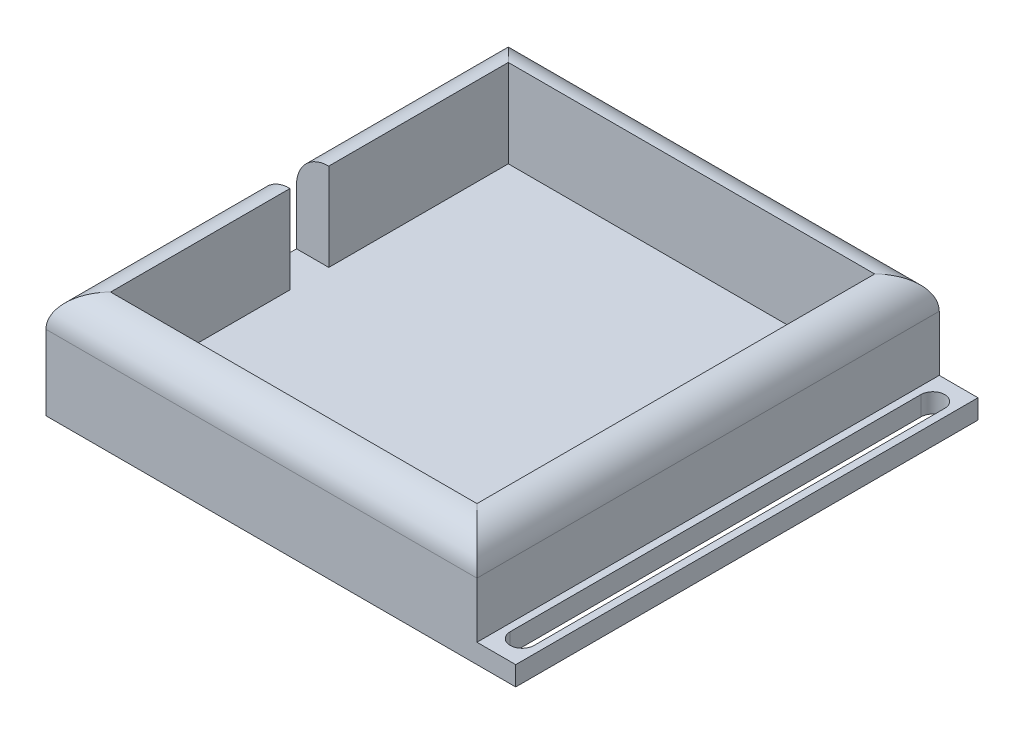
ISO-10303-21;
HEADER;
FILE_DESCRIPTION(('STEP AP214'),'2;1');
FILE_NAME('part.step','',(''),(''),'','','');
FILE_SCHEMA(('AUTOMOTIVE_DESIGN { 1 0 10303 214 1 1 1 1 }'));
ENDSEC;
DATA;
#1=APPLICATION_CONTEXT('core data for automotive mechanical design processes');
#2=APPLICATION_PROTOCOL_DEFINITION('international standard','automotive_design',2000,#1);
#3=PRODUCT_CONTEXT('',#1,'mechanical');
#4=PRODUCT('Part','Part','',(#3));
#5=PRODUCT_RELATED_PRODUCT_CATEGORY('part','',(#4));
#6=PRODUCT_DEFINITION_FORMATION('','',#4);
#7=PRODUCT_DEFINITION_CONTEXT('part definition',#1,'design');
#8=PRODUCT_DEFINITION('design','',#6,#7);
#9=PRODUCT_DEFINITION_SHAPE('','',#8);
#10=(LENGTH_UNIT() NAMED_UNIT(*) SI_UNIT(.MILLI.,.METRE.));
#11=(NAMED_UNIT(*) PLANE_ANGLE_UNIT() SI_UNIT($,.RADIAN.));
#12=(NAMED_UNIT(*) SI_UNIT($,.STERADIAN.) SOLID_ANGLE_UNIT());
#13=UNCERTAINTY_MEASURE_WITH_UNIT(LENGTH_MEASURE(1.E-05),#10,'distance_accuracy_value','');
#14=(GEOMETRIC_REPRESENTATION_CONTEXT(3) GLOBAL_UNCERTAINTY_ASSIGNED_CONTEXT((#13)) GLOBAL_UNIT_ASSIGNED_CONTEXT((#10,
#11,#12)) REPRESENTATION_CONTEXT('',''));
#15=CARTESIAN_POINT('',(0.,0.,0.));
#16=DIRECTION('',(0.,0.,1.));
#17=DIRECTION('',(1.,0.,0.));
#18=AXIS2_PLACEMENT_3D('',#15,#16,#17);
#19=CARTESIAN_POINT('',(61.75,13.6,0.));
#20=DIRECTION('',(-1.,0.,0.));
#21=DIRECTION('',(0.,0.,1.));
#22=AXIS2_PLACEMENT_3D('',#19,#20,#21);
#23=PLANE('',#22);
#24=DIRECTION('',(0.,0.,1.));
#25=VECTOR('',#24,1.);
#26=CARTESIAN_POINT('',(61.75,0.,0.));
#27=LINE('',#26,#25);
#28=CARTESIAN_POINT('',(61.75,0.,-66.6));
#29=VERTEX_POINT('',#28);
#30=CARTESIAN_POINT('',(61.75,0.,5.));
#31=VERTEX_POINT('',#30);
#32=EDGE_CURVE('E218',#29,#31,#27,.T.);
#33=ORIENTED_EDGE('',*,*,#32,.F.);
#34=DIRECTION('',(0.,-1.,0.));
#35=VECTOR('',#34,1.);
#36=CARTESIAN_POINT('',(61.75,13.6,-66.6));
#37=LINE('',#36,#35);
#38=CARTESIAN_POINT('',(61.75,8.6,-66.6));
#39=VERTEX_POINT('',#38);
#40=EDGE_CURVE('E329',#39,#29,#37,.T.);
#41=ORIENTED_EDGE('',*,*,#40,.F.);
#42=DIRECTION('',(0.,0.,-1.));
#43=VECTOR('',#42,1.);
#44=CARTESIAN_POINT('',(61.75,8.6,5.));
#45=LINE('',#44,#43);
#46=CARTESIAN_POINT('',(61.75,8.6,5.));
#47=VERTEX_POINT('',#46);
#48=EDGE_CURVE('E11',#39,#47,#45,.F.);
#49=ORIENTED_EDGE('',*,*,#48,.T.);
#50=DIRECTION('',(0.,-1.,0.));
#51=VECTOR('',#50,1.);
#52=CARTESIAN_POINT('',(61.75,13.6,5.));
#53=LINE('',#52,#51);
#54=EDGE_CURVE('E332',#47,#31,#53,.T.);
#55=ORIENTED_EDGE('',*,*,#54,.T.);
#56=EDGE_LOOP('',(#33,#41,#49,#55));
#57=FACE_BOUND('',#56,.T.);
#58=ADVANCED_FACE('F41',(#57),#23,.F.);
#59=CARTESIAN_POINT('',(56.75,13.6,0.));
#60=DIRECTION('',(-1.,0.,0.));
#61=DIRECTION('',(0.,0.,1.));
#62=AXIS2_PLACEMENT_3D('',#59,#60,#61);
#63=PLANE('',#62);
#64=DIRECTION('',(0.,0.,-1.));
#65=VECTOR('',#64,1.);
#66=CARTESIAN_POINT('',(56.75,0.,0.));
#67=LINE('',#66,#65);
#68=CARTESIAN_POINT('',(56.75,0.,0.));
#69=VERTEX_POINT('',#68);
#70=CARTESIAN_POINT('',(56.75,0.,-61.6));
#71=VERTEX_POINT('',#70);
#72=EDGE_CURVE('E263',#69,#71,#67,.T.);
#73=ORIENTED_EDGE('',*,*,#72,.F.);
#74=DIRECTION('',(0.,-1.,0.));
#75=VECTOR('',#74,1.);
#76=CARTESIAN_POINT('',(56.75,13.6,0.));
#77=LINE('',#76,#75);
#78=CARTESIAN_POINT('',(56.75,13.6,0.));
#79=VERTEX_POINT('',#78);
#80=EDGE_CURVE('E347',#79,#69,#77,.T.);
#81=ORIENTED_EDGE('',*,*,#80,.F.);
#82=DIRECTION('',(0.,0.,-1.));
#83=VECTOR('',#82,1.);
#84=CARTESIAN_POINT('',(56.75,13.6,0.));
#85=LINE('',#84,#83);
#86=CARTESIAN_POINT('',(56.75,13.6,-61.6));
#87=VERTEX_POINT('',#86);
#88=EDGE_CURVE('E267',#79,#87,#85,.T.);
#89=ORIENTED_EDGE('',*,*,#88,.T.);
#90=DIRECTION('',(0.,-1.,0.));
#91=VECTOR('',#90,1.);
#92=CARTESIAN_POINT('',(56.75,13.6,-61.6));
#93=LINE('',#92,#91);
#94=EDGE_CURVE('E288',#87,#71,#93,.T.);
#95=ORIENTED_EDGE('',*,*,#94,.T.);
#96=EDGE_LOOP('',(#73,#81,#89,#95));
#97=FACE_BOUND('',#96,.T.);
#98=ADVANCED_FACE('F419',(#97),#63,.T.);
#99=CARTESIAN_POINT('',(0.,13.6,0.));
#100=DIRECTION('',(0.,0.,-1.));
#101=DIRECTION('',(-1.,0.,0.));
#102=AXIS2_PLACEMENT_3D('',#99,#100,#101);
#103=PLANE('',#102);
#104=DIRECTION('',(1.,0.,0.));
#105=VECTOR('',#104,1.);
#106=CARTESIAN_POINT('',(0.,0.,0.));
#107=LINE('',#106,#105);
#108=CARTESIAN_POINT('',(0.,0.,0.));
#109=VERTEX_POINT('',#108);
#110=EDGE_CURVE('E292',#109,#69,#107,.T.);
#111=ORIENTED_EDGE('',*,*,#110,.F.);
#112=DIRECTION('',(0.,-1.,0.));
#113=VECTOR('',#112,1.);
#114=CARTESIAN_POINT('',(0.,13.6,0.));
#115=LINE('',#114,#113);
#116=CARTESIAN_POINT('',(0.,13.6,0.));
#117=VERTEX_POINT('',#116);
#118=EDGE_CURVE('E344',#117,#109,#115,.T.);
#119=ORIENTED_EDGE('',*,*,#118,.F.);
#120=DIRECTION('',(1.,0.,0.));
#121=VECTOR('',#120,1.);
#122=CARTESIAN_POINT('',(0.,13.6,0.));
#123=LINE('',#122,#121);
#124=EDGE_CURVE('E271',#117,#79,#123,.T.);
#125=ORIENTED_EDGE('',*,*,#124,.T.);
#126=ORIENTED_EDGE('',*,*,#80,.T.);
#127=EDGE_LOOP('',(#111,#119,#125,#126));
#128=FACE_BOUND('',#127,.T.);
#129=ADVANCED_FACE('F422',(#128),#103,.T.);
#130=CARTESIAN_POINT('',(0.,13.6,0.));
#131=DIRECTION('',(-1.,0.,0.));
#132=DIRECTION('',(0.,0.,1.));
#133=AXIS2_PLACEMENT_3D('',#130,#131,#132);
#134=PLANE('',#133);
#135=DIRECTION('',(0.,0.,-1.));
#136=VECTOR('',#135,1.);
#137=CARTESIAN_POINT('',(0.,0.,0.));
#138=LINE('',#137,#136);
#139=CARTESIAN_POINT('',(0.,0.,-27.8));
#140=VERTEX_POINT('',#139);
#141=EDGE_CURVE('E296',#109,#140,#138,.T.);
#142=ORIENTED_EDGE('',*,*,#141,.T.);
#143=DIRECTION('',(0.,-1.,0.));
#144=VECTOR('',#143,1.);
#145=CARTESIAN_POINT('',(0.,13.6,-27.8));
#146=LINE('',#145,#144);
#147=CARTESIAN_POINT('',(0.,13.6,-27.8));
#148=VERTEX_POINT('',#147);
#149=EDGE_CURVE('E341',#148,#140,#146,.T.);
#150=ORIENTED_EDGE('',*,*,#149,.F.);
#151=DIRECTION('',(0.,0.,-1.));
#152=VECTOR('',#151,1.);
#153=CARTESIAN_POINT('',(0.,13.6,0.));
#154=LINE('',#153,#152);
#155=EDGE_CURVE('E276',#117,#148,#154,.T.);
#156=ORIENTED_EDGE('',*,*,#155,.F.);
#157=ORIENTED_EDGE('',*,*,#118,.T.);
#158=EDGE_LOOP('',(#142,#150,#156,#157));
#159=FACE_BOUND('',#158,.T.);
#160=ADVANCED_FACE('F424',(#159),#134,.F.);
#161=CARTESIAN_POINT('',(0.,13.6,-27.8));
#162=DIRECTION('',(0.,0.,-1.));
#163=DIRECTION('',(-1.,0.,0.));
#164=AXIS2_PLACEMENT_3D('',#161,#162,#163);
#165=PLANE('',#164);
#166=DIRECTION('',(0.,-1.,0.));
#167=VECTOR('',#166,1.);
#168=CARTESIAN_POINT('',(-5.,13.6,-27.8));
#169=LINE('',#168,#167);
#170=CARTESIAN_POINT('',(-5.,8.6,-27.8));
#171=VERTEX_POINT('',#170);
#172=CARTESIAN_POINT('',(-5.,0.,-27.8));
#173=VERTEX_POINT('',#172);
#174=EDGE_CURVE('E338',#171,#173,#169,.T.);
#175=ORIENTED_EDGE('',*,*,#174,.F.);
#176=CARTESIAN_POINT('',(0.,8.6,-27.8));
#177=DIRECTION('',(0.,0.,-1.));
#178=DIRECTION('',(-1.,0.,0.));
#179=AXIS2_PLACEMENT_3D('',#176,#177,#178);
#180=CIRCLE('',#179,5.);
#181=EDGE_CURVE('E361',#171,#148,#180,.T.);
#182=ORIENTED_EDGE('',*,*,#181,.T.);
#183=ORIENTED_EDGE('',*,*,#149,.T.);
#184=DIRECTION('',(1.,0.,0.));
#185=VECTOR('',#184,1.);
#186=CARTESIAN_POINT('',(0.,0.,-27.8));
#187=LINE('',#186,#185);
#188=EDGE_CURVE('E300',#173,#140,#187,.T.);
#189=ORIENTED_EDGE('',*,*,#188,.F.);
#190=EDGE_LOOP('',(#175,#182,#183,#189));
#191=FACE_BOUND('',#190,.T.);
#192=ADVANCED_FACE('F398',(#191),#165,.T.);
#193=CARTESIAN_POINT('',(0.,13.6,5.));
#194=DIRECTION('',(0.,0.,-1.));
#195=DIRECTION('',(-1.,0.,0.));
#196=AXIS2_PLACEMENT_3D('',#193,#194,#195);
#197=PLANE('',#196);
#198=ORIENTED_EDGE('',*,*,#54,.F.);
#199=DIRECTION('',(1.,0.,0.));
#200=VECTOR('',#199,1.);
#201=CARTESIAN_POINT('',(-5.,8.6,5.));
#202=LINE('',#201,#200);
#203=CARTESIAN_POINT('',(-5.,8.6,5.));
#204=VERTEX_POINT('',#203);
#205=EDGE_CURVE('E51',#47,#204,#202,.F.);
#206=ORIENTED_EDGE('',*,*,#205,.T.);
#207=DIRECTION('',(0.,-1.,0.));
#208=VECTOR('',#207,1.);
#209=CARTESIAN_POINT('',(-5.,13.6,5.));
#210=LINE('',#209,#208);
#211=CARTESIAN_POINT('',(-5.,-3.,5.));
#212=VERTEX_POINT('',#211);
#213=EDGE_CURVE('E335',#204,#212,#210,.T.);
#214=ORIENTED_EDGE('',*,*,#213,.T.);
#215=DIRECTION('',(-1.,0.,0.));
#216=VECTOR('',#215,1.);
#217=CARTESIAN_POINT('',(0.,-3.,5.));
#218=LINE('',#217,#216);
#219=CARTESIAN_POINT('',(67.75,-3.,5.));
#220=VERTEX_POINT('',#219);
#221=EDGE_CURVE('E251',#220,#212,#218,.T.);
#222=ORIENTED_EDGE('',*,*,#221,.F.);
#223=DIRECTION('',(0.,-1.,0.));
#224=VECTOR('',#223,1.);
#225=CARTESIAN_POINT('',(67.75,0.,5.));
#226=LINE('',#225,#224);
#227=CARTESIAN_POINT('',(67.75,0.,5.));
#228=VERTEX_POINT('',#227);
#229=EDGE_CURVE('E240',#228,#220,#226,.T.);
#230=ORIENTED_EDGE('',*,*,#229,.F.);
#231=DIRECTION('',(1.,0.,0.));
#232=VECTOR('',#231,1.);
#233=CARTESIAN_POINT('',(0.,0.,4.99999999999999));
#234=LINE('',#233,#232);
#235=EDGE_CURVE('E215',#31,#228,#234,.T.);
#236=ORIENTED_EDGE('',*,*,#235,.F.);
#237=EDGE_LOOP('',(#198,#206,#214,#222,#230,#236));
#238=FACE_BOUND('',#237,.T.);
#239=ADVANCED_FACE('F449',(#238),#197,.F.);
#240=CARTESIAN_POINT('',(0.,13.6,-66.6));
#241=DIRECTION('',(0.,0.,-1.));
#242=DIRECTION('',(-1.,0.,0.));
#243=AXIS2_PLACEMENT_3D('',#240,#241,#242);
#244=PLANE('',#243);
#245=DIRECTION('',(0.,-1.,0.));
#246=VECTOR('',#245,1.);
#247=CARTESIAN_POINT('',(-5.,13.6,-66.6));
#248=LINE('',#247,#246);
#249=CARTESIAN_POINT('',(-5.,8.6,-66.6));
#250=VERTEX_POINT('',#249);
#251=CARTESIAN_POINT('',(-5.,-3.,-66.6));
#252=VERTEX_POINT('',#251);
#253=EDGE_CURVE('E326',#250,#252,#248,.T.);
#254=ORIENTED_EDGE('',*,*,#253,.F.);
#255=DIRECTION('',(1.,0.,0.));
#256=VECTOR('',#255,1.);
#257=CARTESIAN_POINT('',(0.,8.6,-66.6));
#258=LINE('',#257,#256);
#259=EDGE_CURVE('E65',#250,#39,#258,.T.);
#260=ORIENTED_EDGE('',*,*,#259,.T.);
#261=ORIENTED_EDGE('',*,*,#40,.T.);
#262=DIRECTION('',(1.,0.,0.));
#263=VECTOR('',#262,1.);
#264=CARTESIAN_POINT('',(0.,0.,-66.6));
#265=LINE('',#264,#263);
#266=CARTESIAN_POINT('',(67.75,0.,-66.6));
#267=VERTEX_POINT('',#266);
#268=EDGE_CURVE('E194',#29,#267,#265,.T.);
#269=ORIENTED_EDGE('',*,*,#268,.T.);
#270=DIRECTION('',(0.,-1.,0.));
#271=VECTOR('',#270,1.);
#272=CARTESIAN_POINT('',(67.75,0.,-66.6));
#273=LINE('',#272,#271);
#274=CARTESIAN_POINT('',(67.75,-3.,-66.6));
#275=VERTEX_POINT('',#274);
#276=EDGE_CURVE('E235',#267,#275,#273,.T.);
#277=ORIENTED_EDGE('',*,*,#276,.T.);
#278=DIRECTION('',(1.,0.,0.));
#279=VECTOR('',#278,1.);
#280=CARTESIAN_POINT('',(0.,-3.,-66.6));
#281=LINE('',#280,#279);
#282=EDGE_CURVE('E260',#252,#275,#281,.T.);
#283=ORIENTED_EDGE('',*,*,#282,.F.);
#284=EDGE_LOOP('',(#254,#260,#261,#269,#277,#283));
#285=FACE_BOUND('',#284,.T.);
#286=ADVANCED_FACE('F438',(#285),#244,.T.);
#287=CARTESIAN_POINT('',(-5.,13.6,0.));
#288=DIRECTION('',(-1.,0.,0.));
#289=DIRECTION('',(0.,0.,1.));
#290=AXIS2_PLACEMENT_3D('',#287,#288,#289);
#291=PLANE('',#290);
#292=DIRECTION('',(0.,-1.,0.));
#293=VECTOR('',#292,1.);
#294=CARTESIAN_POINT('',(-5.,13.6,-33.8));
#295=LINE('',#294,#293);
#296=CARTESIAN_POINT('',(-5.,8.6,-33.8));
#297=VERTEX_POINT('',#296);
#298=CARTESIAN_POINT('',(-5.,0.,-33.8));
#299=VERTEX_POINT('',#298);
#300=EDGE_CURVE('E323',#297,#299,#295,.T.);
#301=ORIENTED_EDGE('',*,*,#300,.F.);
#302=DIRECTION('',(0.,0.,-1.));
#303=VECTOR('',#302,1.);
#304=CARTESIAN_POINT('',(-5.,8.6,0.));
#305=LINE('',#304,#303);
#306=EDGE_CURVE('E354',#297,#250,#305,.T.);
#307=ORIENTED_EDGE('',*,*,#306,.T.);
#308=ORIENTED_EDGE('',*,*,#253,.T.);
#309=DIRECTION('',(0.,0.,-1.));
#310=VECTOR('',#309,1.);
#311=CARTESIAN_POINT('',(-5.,-3.,0.));
#312=LINE('',#311,#310);
#313=EDGE_CURVE('E255',#212,#252,#312,.T.);
#314=ORIENTED_EDGE('',*,*,#313,.F.);
#315=ORIENTED_EDGE('',*,*,#213,.F.);
#316=DIRECTION('',(0.,0.,-1.));
#317=VECTOR('',#316,1.);
#318=CARTESIAN_POINT('',(-5.,8.6,0.));
#319=LINE('',#318,#317);
#320=EDGE_CURVE('E351',#204,#171,#319,.T.);
#321=ORIENTED_EDGE('',*,*,#320,.T.);
#322=ORIENTED_EDGE('',*,*,#174,.T.);
#323=DIRECTION('',(0.,0.,-1.));
#324=VECTOR('',#323,1.);
#325=CARTESIAN_POINT('',(-5.,0.,0.));
#326=LINE('',#325,#324);
#327=EDGE_CURVE('E256',#173,#299,#326,.T.);
#328=ORIENTED_EDGE('',*,*,#327,.T.);
#329=EDGE_LOOP('',(#301,#307,#308,#314,#315,#321,#322,#328));
#330=FACE_BOUND('',#329,.T.);
#331=ADVANCED_FACE('F394',(#330),#291,.T.);
#332=CARTESIAN_POINT('',(0.,13.6,-33.8));
#333=DIRECTION('',(0.,0.,-1.));
#334=DIRECTION('',(-1.,0.,0.));
#335=AXIS2_PLACEMENT_3D('',#332,#333,#334);
#336=PLANE('',#335);
#337=DIRECTION('',(0.,-1.,0.));
#338=VECTOR('',#337,1.);
#339=CARTESIAN_POINT('',(0.,13.6,-33.8));
#340=LINE('',#339,#338);
#341=CARTESIAN_POINT('',(0.,13.6,-33.8));
#342=VERTEX_POINT('',#341);
#343=CARTESIAN_POINT('',(0.,0.,-33.8));
#344=VERTEX_POINT('',#343);
#345=EDGE_CURVE('E319',#342,#344,#340,.T.);
#346=ORIENTED_EDGE('',*,*,#345,.F.);
#347=CARTESIAN_POINT('',(0.,8.6,-33.8));
#348=DIRECTION('',(0.,0.,-1.));
#349=DIRECTION('',(-1.,0.,0.));
#350=AXIS2_PLACEMENT_3D('',#347,#348,#349);
#351=CIRCLE('',#350,5.);
#352=EDGE_CURVE('E358',#342,#297,#351,.F.);
#353=ORIENTED_EDGE('',*,*,#352,.T.);
#354=ORIENTED_EDGE('',*,*,#300,.T.);
#355=DIRECTION('',(1.,0.,0.));
#356=VECTOR('',#355,1.);
#357=CARTESIAN_POINT('',(0.,0.,-33.8));
#358=LINE('',#357,#356);
#359=EDGE_CURVE('E304',#299,#344,#358,.T.);
#360=ORIENTED_EDGE('',*,*,#359,.T.);
#361=EDGE_LOOP('',(#346,#353,#354,#360));
#362=FACE_BOUND('',#361,.T.);
#363=ADVANCED_FACE('F430',(#362),#336,.F.);
#364=CARTESIAN_POINT('',(0.,13.6,0.));
#365=DIRECTION('',(-1.,0.,0.));
#366=DIRECTION('',(0.,0.,1.));
#367=AXIS2_PLACEMENT_3D('',#364,#365,#366);
#368=PLANE('',#367);
#369=DIRECTION('',(0.,0.,-1.));
#370=VECTOR('',#369,1.);
#371=CARTESIAN_POINT('',(0.,0.,0.));
#372=LINE('',#371,#370);
#373=CARTESIAN_POINT('',(0.,0.,-61.6));
#374=VERTEX_POINT('',#373);
#375=EDGE_CURVE('E307',#344,#374,#372,.T.);
#376=ORIENTED_EDGE('',*,*,#375,.T.);
#377=DIRECTION('',(0.,-1.,0.));
#378=VECTOR('',#377,1.);
#379=CARTESIAN_POINT('',(0.,13.6,-61.6));
#380=LINE('',#379,#378);
#381=CARTESIAN_POINT('',(0.,13.6,-61.6));
#382=VERTEX_POINT('',#381);
#383=EDGE_CURVE('E315',#382,#374,#380,.T.);
#384=ORIENTED_EDGE('',*,*,#383,.F.);
#385=DIRECTION('',(0.,0.,-1.));
#386=VECTOR('',#385,1.);
#387=CARTESIAN_POINT('',(0.,13.6,0.));
#388=LINE('',#387,#386);
#389=EDGE_CURVE('E280',#342,#382,#388,.T.);
#390=ORIENTED_EDGE('',*,*,#389,.F.);
#391=ORIENTED_EDGE('',*,*,#345,.T.);
#392=EDGE_LOOP('',(#376,#384,#390,#391));
#393=FACE_BOUND('',#392,.T.);
#394=ADVANCED_FACE('F429',(#393),#368,.F.);
#395=CARTESIAN_POINT('',(0.,13.6,-61.6));
#396=DIRECTION('',(0.,0.,-1.));
#397=DIRECTION('',(-1.,0.,0.));
#398=AXIS2_PLACEMENT_3D('',#395,#396,#397);
#399=PLANE('',#398);
#400=DIRECTION('',(1.,0.,0.));
#401=VECTOR('',#400,1.);
#402=CARTESIAN_POINT('',(0.,0.,-61.6));
#403=LINE('',#402,#401);
#404=EDGE_CURVE('E272',#374,#71,#403,.T.);
#405=ORIENTED_EDGE('',*,*,#404,.T.);
#406=ORIENTED_EDGE('',*,*,#94,.F.);
#407=DIRECTION('',(1.,0.,0.));
#408=VECTOR('',#407,1.);
#409=CARTESIAN_POINT('',(0.,13.6,-61.6));
#410=LINE('',#409,#408);
#411=EDGE_CURVE('E284',#382,#87,#410,.T.);
#412=ORIENTED_EDGE('',*,*,#411,.F.);
#413=ORIENTED_EDGE('',*,*,#383,.T.);
#414=EDGE_LOOP('',(#405,#406,#412,#413));
#415=FACE_BOUND('',#414,.T.);
#416=ADVANCED_FACE('F427',(#415),#399,.F.);
#417=CARTESIAN_POINT('',(0.,-3.,0.));
#418=DIRECTION('',(0.,-1.,0.));
#419=DIRECTION('',(0.,0.,-1.));
#420=AXIS2_PLACEMENT_3D('',#417,#418,#419);
#421=PLANE('',#420);
#422=ORIENTED_EDGE('',*,*,#221,.T.);
#423=ORIENTED_EDGE('',*,*,#313,.T.);
#424=ORIENTED_EDGE('',*,*,#282,.T.);
#425=DIRECTION('',(0.,0.,-1.));
#426=VECTOR('',#425,1.);
#427=CARTESIAN_POINT('',(67.75,-3.,0.));
#428=LINE('',#427,#426);
#429=EDGE_CURVE('E200',#220,#275,#428,.T.);
#430=ORIENTED_EDGE('',*,*,#429,.F.);
#431=EDGE_LOOP('',(#422,#423,#424,#430));
#432=FACE_BOUND('',#431,.T.);
#433=CARTESIAN_POINT('',(64.75,-3.,-62.6));
#434=DIRECTION('',(0.,-1.,0.));
#435=DIRECTION('',(0.,0.,-1.));
#436=AXIS2_PLACEMENT_3D('',#433,#434,#435);
#437=CIRCLE('',#436,1.85000000000001);
#438=CARTESIAN_POINT('',(62.9,-3.,-62.6));
#439=VERTEX_POINT('',#438);
#440=CARTESIAN_POINT('',(66.6,-3.,-62.6));
#441=VERTEX_POINT('',#440);
#442=EDGE_CURVE('E224',#439,#441,#437,.T.);
#443=ORIENTED_EDGE('',*,*,#442,.F.);
#444=DIRECTION('',(0.,0.,-1.));
#445=VECTOR('',#444,1.);
#446=CARTESIAN_POINT('',(62.9,-3.,0.));
#447=LINE('',#446,#445);
#448=CARTESIAN_POINT('',(62.9,-3.,1.00000000000001));
#449=VERTEX_POINT('',#448);
#450=EDGE_CURVE('E188',#449,#439,#447,.T.);
#451=ORIENTED_EDGE('',*,*,#450,.F.);
#452=CARTESIAN_POINT('',(64.75,-3.,1.00000000000001));
#453=DIRECTION('',(0.,-1.,0.));
#454=DIRECTION('',(0.,0.,-1.));
#455=AXIS2_PLACEMENT_3D('',#452,#453,#454);
#456=CIRCLE('',#455,1.85);
#457=CARTESIAN_POINT('',(66.6,-3.,1.00000000000001));
#458=VERTEX_POINT('',#457);
#459=EDGE_CURVE('E229',#458,#449,#456,.T.);
#460=ORIENTED_EDGE('',*,*,#459,.F.);
#461=DIRECTION('',(0.,0.,-1.));
#462=VECTOR('',#461,1.);
#463=CARTESIAN_POINT('',(66.6,-3.,0.));
#464=LINE('',#463,#462);
#465=EDGE_CURVE('E204',#458,#441,#464,.T.);
#466=ORIENTED_EDGE('',*,*,#465,.T.);
#467=EDGE_LOOP('',(#443,#451,#460,#466));
#468=FACE_BOUND('',#467,.T.);
#469=ADVANCED_FACE('F472',(#432,#468),#421,.T.);
#470=CARTESIAN_POINT('',(0.,0.,0.));
#471=DIRECTION('',(0.,-1.,0.));
#472=DIRECTION('',(0.,0.,-1.));
#473=AXIS2_PLACEMENT_3D('',#470,#471,#472);
#474=PLANE('',#473);
#475=ORIENTED_EDGE('',*,*,#359,.F.);
#476=ORIENTED_EDGE('',*,*,#327,.F.);
#477=ORIENTED_EDGE('',*,*,#188,.T.);
#478=ORIENTED_EDGE('',*,*,#141,.F.);
#479=ORIENTED_EDGE('',*,*,#110,.T.);
#480=ORIENTED_EDGE('',*,*,#72,.T.);
#481=ORIENTED_EDGE('',*,*,#404,.F.);
#482=ORIENTED_EDGE('',*,*,#375,.F.);
#483=EDGE_LOOP('',(#475,#476,#477,#478,#479,#480,#481,#482));
#484=FACE_BOUND('',#483,.T.);
#485=ADVANCED_FACE('F404',(#484),#474,.F.);
#486=CARTESIAN_POINT('',(0.,8.6,0.));
#487=DIRECTION('',(0.,0.,-1.));
#488=DIRECTION('',(-1.,0.,0.));
#489=AXIS2_PLACEMENT_3D('',#486,#487,#488);
#490=CYLINDRICAL_SURFACE('',#489,5.);
#491=ORIENTED_EDGE('',*,*,#181,.F.);
#492=ORIENTED_EDGE('',*,*,#320,.F.);
#493=CARTESIAN_POINT('',(0.,8.6,0.));
#494=DIRECTION('',(-0.707106781186547,0.,-0.707106781186547));
#495=DIRECTION('',(-0.707106781186547,0.,0.707106781186547));
#496=AXIS2_PLACEMENT_3D('',#493,#494,#495);
#497=ELLIPSE('',#496,7.07106781186547,5.);
#498=EDGE_CURVE('E45',#117,#204,#497,.F.);
#499=ORIENTED_EDGE('',*,*,#498,.F.);
#500=ORIENTED_EDGE('',*,*,#155,.T.);
#501=EDGE_LOOP('',(#491,#492,#499,#500));
#502=FACE_BOUND('',#501,.T.);
#503=ADVANCED_FACE('F43',(#502),#490,.T.);
#504=CARTESIAN_POINT('',(0.,8.6,0.));
#505=DIRECTION('',(-1.,0.,0.));
#506=DIRECTION('',(0.,0.,1.));
#507=AXIS2_PLACEMENT_3D('',#504,#505,#506);
#508=CYLINDRICAL_SURFACE('',#507,5.);
#509=ORIENTED_EDGE('',*,*,#498,.T.);
#510=ORIENTED_EDGE('',*,*,#205,.F.);
#511=CARTESIAN_POINT('',(56.75,8.6,0.));
#512=DIRECTION('',(-0.707106781186547,0.,0.707106781186547));
#513=DIRECTION('',(0.707106781186547,0.,0.707106781186547));
#514=AXIS2_PLACEMENT_3D('',#511,#512,#513);
#515=ELLIPSE('',#514,7.07106781186547,5.);
#516=EDGE_CURVE('E373',#79,#47,#515,.F.);
#517=ORIENTED_EDGE('',*,*,#516,.F.);
#518=ORIENTED_EDGE('',*,*,#124,.F.);
#519=EDGE_LOOP('',(#509,#510,#517,#518));
#520=FACE_BOUND('',#519,.T.);
#521=ADVANCED_FACE('F385',(#520),#508,.T.);
#522=CARTESIAN_POINT('',(56.75,8.6,0.));
#523=DIRECTION('',(0.,0.,1.));
#524=DIRECTION('',(1.,0.,0.));
#525=AXIS2_PLACEMENT_3D('',#522,#523,#524);
#526=CYLINDRICAL_SURFACE('',#525,5.);
#527=ORIENTED_EDGE('',*,*,#516,.T.);
#528=ORIENTED_EDGE('',*,*,#48,.F.);
#529=CARTESIAN_POINT('',(56.75,8.6,-61.6));
#530=DIRECTION('',(0.707106781186547,0.,0.707106781186547));
#531=DIRECTION('',(-0.707106781186547,0.,0.707106781186547));
#532=AXIS2_PLACEMENT_3D('',#529,#530,#531);
#533=ELLIPSE('',#532,7.07106781186547,5.);
#534=EDGE_CURVE('E370',#87,#39,#533,.F.);
#535=ORIENTED_EDGE('',*,*,#534,.F.);
#536=ORIENTED_EDGE('',*,*,#88,.F.);
#537=EDGE_LOOP('',(#527,#528,#535,#536));
#538=FACE_BOUND('',#537,.T.);
#539=ADVANCED_FACE('F417',(#538),#526,.T.);
#540=CARTESIAN_POINT('',(0.,8.6,-61.6));
#541=DIRECTION('',(1.,0.,0.));
#542=DIRECTION('',(0.,0.,-1.));
#543=AXIS2_PLACEMENT_3D('',#540,#541,#542);
#544=CYLINDRICAL_SURFACE('',#543,5.);
#545=ORIENTED_EDGE('',*,*,#534,.T.);
#546=ORIENTED_EDGE('',*,*,#259,.F.);
#547=CARTESIAN_POINT('',(0.,8.6,-61.6));
#548=DIRECTION('',(0.707106781186547,0.,-0.707106781186547));
#549=DIRECTION('',(0.707106781186547,0.,0.707106781186547));
#550=AXIS2_PLACEMENT_3D('',#547,#548,#549);
#551=ELLIPSE('',#550,7.07106781186547,5.);
#552=EDGE_CURVE('E239',#382,#250,#551,.F.);
#553=ORIENTED_EDGE('',*,*,#552,.F.);
#554=ORIENTED_EDGE('',*,*,#411,.T.);
#555=EDGE_LOOP('',(#545,#546,#553,#554));
#556=FACE_BOUND('',#555,.T.);
#557=ADVANCED_FACE('F414',(#556),#544,.T.);
#558=CARTESIAN_POINT('',(0.,8.6,0.));
#559=DIRECTION('',(0.,0.,-1.));
#560=DIRECTION('',(-1.,0.,0.));
#561=AXIS2_PLACEMENT_3D('',#558,#559,#560);
#562=CYLINDRICAL_SURFACE('',#561,5.);
#563=ORIENTED_EDGE('',*,*,#352,.F.);
#564=ORIENTED_EDGE('',*,*,#389,.T.);
#565=ORIENTED_EDGE('',*,*,#552,.T.);
#566=ORIENTED_EDGE('',*,*,#306,.F.);
#567=EDGE_LOOP('',(#563,#564,#565,#566));
#568=FACE_BOUND('',#567,.T.);
#569=ADVANCED_FACE('F410',(#568),#562,.T.);
#570=CARTESIAN_POINT('',(67.75,0.,0.));
#571=DIRECTION('',(-1.,0.,0.));
#572=DIRECTION('',(0.,0.,1.));
#573=AXIS2_PLACEMENT_3D('',#570,#571,#572);
#574=PLANE('',#573);
#575=ORIENTED_EDGE('',*,*,#429,.T.);
#576=ORIENTED_EDGE('',*,*,#276,.F.);
#577=DIRECTION('',(0.,0.,-1.));
#578=VECTOR('',#577,1.);
#579=CARTESIAN_POINT('',(67.75,0.,0.));
#580=LINE('',#579,#578);
#581=EDGE_CURVE('E212',#228,#267,#580,.T.);
#582=ORIENTED_EDGE('',*,*,#581,.F.);
#583=ORIENTED_EDGE('',*,*,#229,.T.);
#584=EDGE_LOOP('',(#575,#576,#582,#583));
#585=FACE_BOUND('',#584,.T.);
#586=ADVANCED_FACE('F461',(#585),#574,.F.);
#587=CARTESIAN_POINT('',(64.75,0.,-62.6));
#588=DIRECTION('',(0.,-1.,0.));
#589=DIRECTION('',(0.,0.,-1.));
#590=AXIS2_PLACEMENT_3D('',#587,#588,#589);
#591=CYLINDRICAL_SURFACE('',#590,1.85000000000001);
#592=ORIENTED_EDGE('',*,*,#442,.T.);
#593=DIRECTION('',(0.,-1.,0.));
#594=VECTOR('',#593,1.);
#595=CARTESIAN_POINT('',(66.6,0.,-62.6));
#596=LINE('',#595,#594);
#597=CARTESIAN_POINT('',(66.6,0.,-62.6));
#598=VERTEX_POINT('',#597);
#599=EDGE_CURVE('E197',#598,#441,#596,.T.);
#600=ORIENTED_EDGE('',*,*,#599,.F.);
#601=CARTESIAN_POINT('',(64.75,0.,-62.6));
#602=DIRECTION('',(0.,-1.,0.));
#603=DIRECTION('',(0.,0.,-1.));
#604=AXIS2_PLACEMENT_3D('',#601,#602,#603);
#605=CIRCLE('',#604,1.85000000000001);
#606=CARTESIAN_POINT('',(62.9,0.,-62.6));
#607=VERTEX_POINT('',#606);
#608=EDGE_CURVE('E175',#607,#598,#605,.T.);
#609=ORIENTED_EDGE('',*,*,#608,.F.);
#610=DIRECTION('',(0.,-1.,0.));
#611=VECTOR('',#610,1.);
#612=CARTESIAN_POINT('',(62.9,0.,-62.6));
#613=LINE('',#612,#611);
#614=EDGE_CURVE('E185',#607,#439,#613,.T.);
#615=ORIENTED_EDGE('',*,*,#614,.T.);
#616=EDGE_LOOP('',(#592,#600,#609,#615));
#617=FACE_BOUND('',#616,.T.);
#618=ADVANCED_FACE('F196',(#617),#591,.F.);
#619=CARTESIAN_POINT('',(66.6,0.,0.));
#620=DIRECTION('',(-1.,0.,0.));
#621=DIRECTION('',(0.,0.,1.));
#622=AXIS2_PLACEMENT_3D('',#619,#620,#621);
#623=PLANE('',#622);
#624=ORIENTED_EDGE('',*,*,#465,.F.);
#625=DIRECTION('',(0.,-1.,0.));
#626=VECTOR('',#625,1.);
#627=CARTESIAN_POINT('',(66.6,0.,1.00000000000001));
#628=LINE('',#627,#626);
#629=CARTESIAN_POINT('',(66.6,0.,1.00000000000001));
#630=VERTEX_POINT('',#629);
#631=EDGE_CURVE('E246',#630,#458,#628,.T.);
#632=ORIENTED_EDGE('',*,*,#631,.F.);
#633=DIRECTION('',(0.,0.,-1.));
#634=VECTOR('',#633,1.);
#635=CARTESIAN_POINT('',(66.6,0.,0.));
#636=LINE('',#635,#634);
#637=EDGE_CURVE('E209',#630,#598,#636,.T.);
#638=ORIENTED_EDGE('',*,*,#637,.T.);
#639=ORIENTED_EDGE('',*,*,#599,.T.);
#640=EDGE_LOOP('',(#624,#632,#638,#639));
#641=FACE_BOUND('',#640,.T.);
#642=ADVANCED_FACE('F514',(#641),#623,.T.);
#643=CARTESIAN_POINT('',(64.75,0.,1.00000000000001));
#644=DIRECTION('',(0.,-1.,0.));
#645=DIRECTION('',(0.,0.,-1.));
#646=AXIS2_PLACEMENT_3D('',#643,#644,#645);
#647=CYLINDRICAL_SURFACE('',#646,1.85);
#648=ORIENTED_EDGE('',*,*,#459,.T.);
#649=DIRECTION('',(0.,-1.,0.));
#650=VECTOR('',#649,1.);
#651=CARTESIAN_POINT('',(62.9,0.,1.00000000000001));
#652=LINE('',#651,#650);
#653=CARTESIAN_POINT('',(62.9,0.,1.00000000000001));
#654=VERTEX_POINT('',#653);
#655=EDGE_CURVE('E193',#654,#449,#652,.T.);
#656=ORIENTED_EDGE('',*,*,#655,.F.);
#657=CARTESIAN_POINT('',(64.75,0.,1.00000000000001));
#658=DIRECTION('',(0.,-1.,0.));
#659=DIRECTION('',(0.,0.,-1.));
#660=AXIS2_PLACEMENT_3D('',#657,#658,#659);
#661=CIRCLE('',#660,1.85);
#662=EDGE_CURVE('E178',#630,#654,#661,.T.);
#663=ORIENTED_EDGE('',*,*,#662,.F.);
#664=ORIENTED_EDGE('',*,*,#631,.T.);
#665=EDGE_LOOP('',(#648,#656,#663,#664));
#666=FACE_BOUND('',#665,.T.);
#667=ADVANCED_FACE('F522',(#666),#647,.F.);
#668=CARTESIAN_POINT('',(62.9,0.,0.));
#669=DIRECTION('',(-1.,0.,0.));
#670=DIRECTION('',(0.,0.,1.));
#671=AXIS2_PLACEMENT_3D('',#668,#669,#670);
#672=PLANE('',#671);
#673=ORIENTED_EDGE('',*,*,#450,.T.);
#674=ORIENTED_EDGE('',*,*,#614,.F.);
#675=DIRECTION('',(0.,0.,-1.));
#676=VECTOR('',#675,1.);
#677=CARTESIAN_POINT('',(62.9,0.,0.));
#678=LINE('',#677,#676);
#679=EDGE_CURVE('E169',#654,#607,#678,.T.);
#680=ORIENTED_EDGE('',*,*,#679,.F.);
#681=ORIENTED_EDGE('',*,*,#655,.T.);
#682=EDGE_LOOP('',(#673,#674,#680,#681));
#683=FACE_BOUND('',#682,.T.);
#684=ADVANCED_FACE('F186',(#683),#672,.F.);
#685=CARTESIAN_POINT('',(0.,0.,0.));
#686=DIRECTION('',(0.,-1.,0.));
#687=DIRECTION('',(0.,0.,-1.));
#688=AXIS2_PLACEMENT_3D('',#685,#686,#687);
#689=PLANE('',#688);
#690=ORIENTED_EDGE('',*,*,#608,.T.);
#691=ORIENTED_EDGE('',*,*,#637,.F.);
#692=ORIENTED_EDGE('',*,*,#662,.T.);
#693=ORIENTED_EDGE('',*,*,#679,.T.);
#694=EDGE_LOOP('',(#690,#691,#692,#693));
#695=FACE_BOUND('',#694,.T.);
#696=ORIENTED_EDGE('',*,*,#581,.T.);
#697=ORIENTED_EDGE('',*,*,#268,.F.);
#698=ORIENTED_EDGE('',*,*,#32,.T.);
#699=ORIENTED_EDGE('',*,*,#235,.T.);
#700=EDGE_LOOP('',(#696,#697,#698,#699));
#701=FACE_BOUND('',#700,.T.);
#702=ADVANCED_FACE('F171',(#695,#701),#689,.F.);
#703=CLOSED_SHELL('',(#58,#98,#129,#160,#192,#239,#286,#331,#363,#394,#416,#469,#485,#503,#521,
#539,#557,#569,#586,#618,#642,#667,#684,#702));
#704=MANIFOLD_SOLID_BREP('B2',#703);
#705=ADVANCED_BREP_SHAPE_REPRESENTATION('',(#18,#704),#14);
#706=SHAPE_DEFINITION_REPRESENTATION(#9,#705);
ENDSEC;
END-ISO-10303-21;
